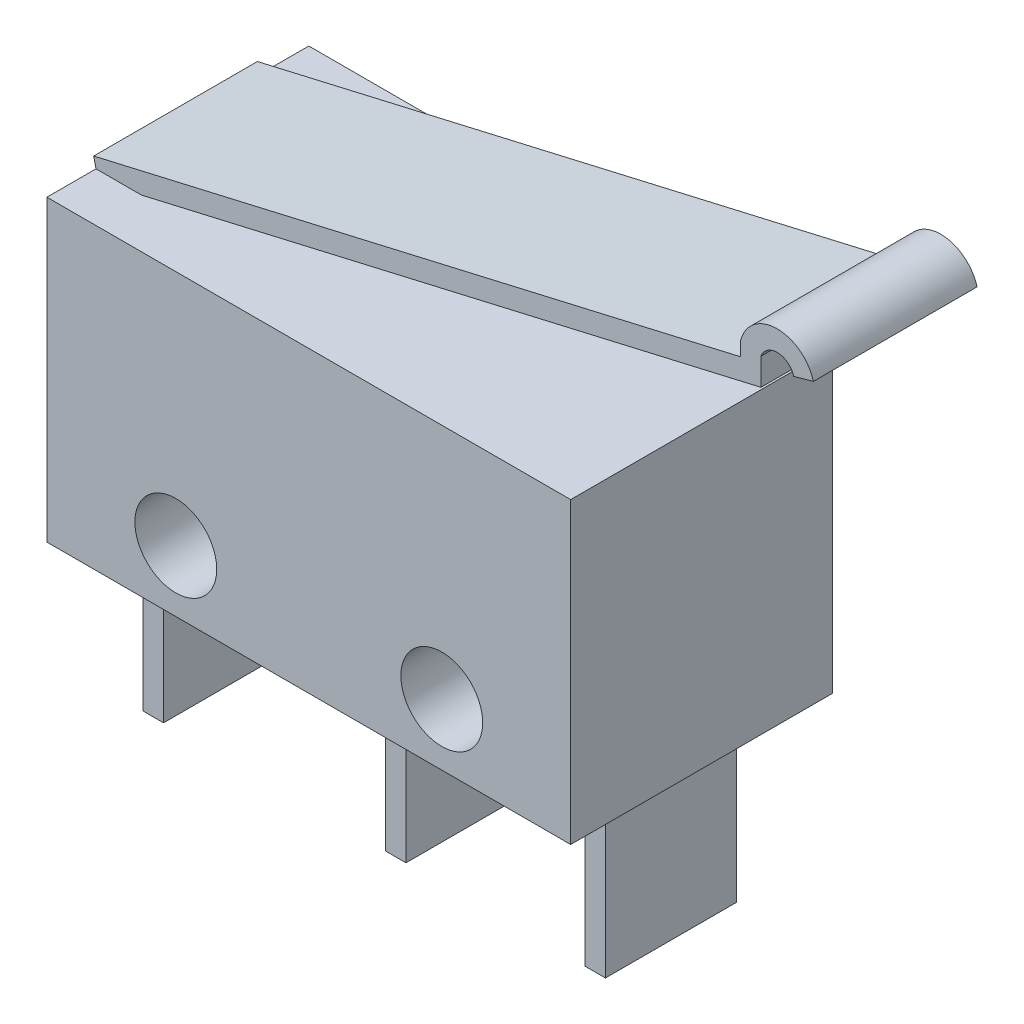
ISO-10303-21;
HEADER;
FILE_DESCRIPTION(('STEP AP214'),'2;1');
FILE_NAME('part.step','',(''),(''),'','','');
FILE_SCHEMA(('AUTOMOTIVE_DESIGN { 1 0 10303 214 1 1 1 1 }'));
ENDSEC;
DATA;
#1=APPLICATION_CONTEXT('core data for automotive mechanical design processes');
#2=APPLICATION_PROTOCOL_DEFINITION('international standard','automotive_design',2000,#1);
#3=PRODUCT_CONTEXT('',#1,'mechanical');
#4=PRODUCT('Part','Part','',(#3));
#5=PRODUCT_RELATED_PRODUCT_CATEGORY('part','',(#4));
#6=PRODUCT_DEFINITION_FORMATION('','',#4);
#7=PRODUCT_DEFINITION_CONTEXT('part definition',#1,'design');
#8=PRODUCT_DEFINITION('design','',#6,#7);
#9=PRODUCT_DEFINITION_SHAPE('','',#8);
#10=(LENGTH_UNIT() NAMED_UNIT(*) SI_UNIT(.MILLI.,.METRE.));
#11=(NAMED_UNIT(*) PLANE_ANGLE_UNIT() SI_UNIT($,.RADIAN.));
#12=(NAMED_UNIT(*) SI_UNIT($,.STERADIAN.) SOLID_ANGLE_UNIT());
#13=UNCERTAINTY_MEASURE_WITH_UNIT(LENGTH_MEASURE(1.E-05),#10,'distance_accuracy_value','');
#14=(GEOMETRIC_REPRESENTATION_CONTEXT(3) GLOBAL_UNCERTAINTY_ASSIGNED_CONTEXT((#13)) GLOBAL_UNIT_ASSIGNED_CONTEXT((#10,
#11,#12)) REPRESENTATION_CONTEXT('',''));
#15=CARTESIAN_POINT('',(0.,0.,0.));
#16=DIRECTION('',(0.,0.,1.));
#17=DIRECTION('',(1.,0.,0.));
#18=AXIS2_PLACEMENT_3D('',#15,#16,#17);
#19=CARTESIAN_POINT('',(-12.8,0.,3.2));
#20=DIRECTION('',(0.,1.,0.));
#21=DIRECTION('',(0.,0.,1.));
#22=AXIS2_PLACEMENT_3D('',#19,#20,#21);
#23=PLANE('',#22);
#24=DIRECTION('',(0.,0.,1.));
#25=VECTOR('',#24,1.);
#26=CARTESIAN_POINT('',(-6.12478735657119,0.,1.6));
#27=LINE('',#26,#25);
#28=CARTESIAN_POINT('',(-6.12478735657119,0.,1.6));
#29=VERTEX_POINT('',#28);
#30=CARTESIAN_POINT('',(-6.12478735657119,0.,-1.6));
#31=VERTEX_POINT('',#30);
#32=EDGE_CURVE('E301',#29,#31,#27,.F.);
#33=ORIENTED_EDGE('',*,*,#32,.F.);
#34=DIRECTION('',(1.,0.,0.));
#35=VECTOR('',#34,1.);
#36=CARTESIAN_POINT('',(-6.12478735657119,0.,1.6));
#37=LINE('',#36,#35);
#38=CARTESIAN_POINT('',(-5.62478735657119,0.,1.6));
#39=VERTEX_POINT('',#38);
#40=EDGE_CURVE('E305',#29,#39,#37,.T.);
#41=ORIENTED_EDGE('',*,*,#40,.T.);
#42=DIRECTION('',(0.,0.,1.));
#43=VECTOR('',#42,1.);
#44=CARTESIAN_POINT('',(-5.62478735657119,0.,1.6));
#45=LINE('',#44,#43);
#46=CARTESIAN_POINT('',(-5.62478735657119,0.,-1.6));
#47=VERTEX_POINT('',#46);
#48=EDGE_CURVE('E320',#39,#47,#45,.F.);
#49=ORIENTED_EDGE('',*,*,#48,.T.);
#50=DIRECTION('',(-1.,0.,0.));
#51=VECTOR('',#50,1.);
#52=CARTESIAN_POINT('',(-5.62478735657119,0.,-1.6));
#53=LINE('',#52,#51);
#54=EDGE_CURVE('E317',#47,#31,#53,.T.);
#55=ORIENTED_EDGE('',*,*,#54,.T.);
#56=EDGE_LOOP('',(#33,#41,#49,#55));
#57=FACE_BOUND('',#56,.T.);
#58=DIRECTION('',(1.,0.,0.));
#59=VECTOR('',#58,1.);
#60=CARTESIAN_POINT('',(-12.8,0.,-3.2));
#61=LINE('',#60,#59);
#62=CARTESIAN_POINT('',(-12.8,0.,-3.2));
#63=VERTEX_POINT('',#62);
#64=CARTESIAN_POINT('',(0.,0.,-3.2));
#65=VERTEX_POINT('',#64);
#66=EDGE_CURVE('E391',#63,#65,#61,.T.);
#67=ORIENTED_EDGE('',*,*,#66,.T.);
#68=DIRECTION('',(0.,0.,-1.));
#69=VECTOR('',#68,1.);
#70=CARTESIAN_POINT('',(0.,0.,3.2));
#71=LINE('',#70,#69);
#72=CARTESIAN_POINT('',(0.,0.,3.2));
#73=VERTEX_POINT('',#72);
#74=EDGE_CURVE('E404',#73,#65,#71,.T.);
#75=ORIENTED_EDGE('',*,*,#74,.F.);
#76=DIRECTION('',(1.,0.,0.));
#77=VECTOR('',#76,1.);
#78=CARTESIAN_POINT('',(-12.8,0.,3.2));
#79=LINE('',#78,#77);
#80=CARTESIAN_POINT('',(-12.8,0.,3.2));
#81=VERTEX_POINT('',#80);
#82=EDGE_CURVE('E381',#81,#73,#79,.T.);
#83=ORIENTED_EDGE('',*,*,#82,.F.);
#84=DIRECTION('',(0.,0.,-1.));
#85=VECTOR('',#84,1.);
#86=CARTESIAN_POINT('',(-12.8,0.,3.2));
#87=LINE('',#86,#85);
#88=EDGE_CURVE('E407',#81,#63,#87,.T.);
#89=ORIENTED_EDGE('',*,*,#88,.T.);
#90=EDGE_LOOP('',(#67,#75,#83,#89));
#91=FACE_BOUND('',#90,.T.);
#92=DIRECTION('',(0.,0.,-1.));
#93=VECTOR('',#92,1.);
#94=CARTESIAN_POINT('',(-12.05,0.,1.6));
#95=LINE('',#94,#93);
#96=CARTESIAN_POINT('',(-12.05,0.,1.6));
#97=VERTEX_POINT('',#96);
#98=CARTESIAN_POINT('',(-12.05,0.,-1.6));
#99=VERTEX_POINT('',#98);
#100=EDGE_CURVE('E333',#97,#99,#95,.T.);
#101=ORIENTED_EDGE('',*,*,#100,.F.);
#102=DIRECTION('',(1.,0.,0.));
#103=VECTOR('',#102,1.);
#104=CARTESIAN_POINT('',(-12.05,0.,1.6));
#105=LINE('',#104,#103);
#106=CARTESIAN_POINT('',(-11.55,0.,1.6));
#107=VERTEX_POINT('',#106);
#108=EDGE_CURVE('E337',#97,#107,#105,.T.);
#109=ORIENTED_EDGE('',*,*,#108,.T.);
#110=DIRECTION('',(0.,0.,-1.));
#111=VECTOR('',#110,1.);
#112=CARTESIAN_POINT('',(-11.55,0.,1.6));
#113=LINE('',#112,#111);
#114=CARTESIAN_POINT('',(-11.55,0.,-1.6));
#115=VERTEX_POINT('',#114);
#116=EDGE_CURVE('E352',#107,#115,#113,.T.);
#117=ORIENTED_EDGE('',*,*,#116,.T.);
#118=DIRECTION('',(-1.,0.,0.));
#119=VECTOR('',#118,1.);
#120=CARTESIAN_POINT('',(-11.55,0.,-1.6));
#121=LINE('',#120,#119);
#122=EDGE_CURVE('E349',#115,#99,#121,.T.);
#123=ORIENTED_EDGE('',*,*,#122,.T.);
#124=EDGE_LOOP('',(#101,#109,#117,#123));
#125=FACE_BOUND('',#124,.T.);
#126=DIRECTION('',(0.,0.,-1.));
#127=VECTOR('',#126,1.);
#128=CARTESIAN_POINT('',(-1.25,0.,1.6));
#129=LINE('',#128,#127);
#130=CARTESIAN_POINT('',(-1.25,0.,1.6));
#131=VERTEX_POINT('',#130);
#132=CARTESIAN_POINT('',(-1.25,0.,-1.6));
#133=VERTEX_POINT('',#132);
#134=EDGE_CURVE('E221',#131,#133,#129,.T.);
#135=ORIENTED_EDGE('',*,*,#134,.F.);
#136=DIRECTION('',(1.,0.,0.));
#137=VECTOR('',#136,1.);
#138=CARTESIAN_POINT('',(-1.25,0.,1.6));
#139=LINE('',#138,#137);
#140=CARTESIAN_POINT('',(-0.749999999999997,0.,1.6));
#141=VERTEX_POINT('',#140);
#142=EDGE_CURVE('E273',#131,#141,#139,.T.);
#143=ORIENTED_EDGE('',*,*,#142,.T.);
#144=DIRECTION('',(0.,0.,-1.));
#145=VECTOR('',#144,1.);
#146=CARTESIAN_POINT('',(-0.749999999999997,0.,1.6));
#147=LINE('',#146,#145);
#148=CARTESIAN_POINT('',(-0.749999999999997,0.,-1.6));
#149=VERTEX_POINT('',#148);
#150=EDGE_CURVE('E288',#141,#149,#147,.T.);
#151=ORIENTED_EDGE('',*,*,#150,.T.);
#152=DIRECTION('',(-1.,0.,0.));
#153=VECTOR('',#152,1.);
#154=CARTESIAN_POINT('',(-0.749999999999997,0.,-1.6));
#155=LINE('',#154,#153);
#156=EDGE_CURVE('E285',#149,#133,#155,.T.);
#157=ORIENTED_EDGE('',*,*,#156,.T.);
#158=EDGE_LOOP('',(#135,#143,#151,#157));
#159=FACE_BOUND('',#158,.T.);
#160=ADVANCED_FACE('F35',(#57,#91,#125,#159),#23,.F.);
#161=CARTESIAN_POINT('',(0.,0.,3.2));
#162=DIRECTION('',(0.,0.,-1.));
#163=DIRECTION('',(-1.,0.,0.));
#164=AXIS2_PLACEMENT_3D('',#161,#162,#163);
#165=PLANE('',#164);
#166=DIRECTION('',(0.,-1.,0.));
#167=VECTOR('',#166,1.);
#168=CARTESIAN_POINT('',(-12.8,0.,3.2));
#169=LINE('',#168,#167);
#170=CARTESIAN_POINT('',(-12.8,7.3,3.2));
#171=VERTEX_POINT('',#170);
#172=EDGE_CURVE('E378',#171,#81,#169,.T.);
#173=ORIENTED_EDGE('',*,*,#172,.T.);
#174=ORIENTED_EDGE('',*,*,#82,.T.);
#175=DIRECTION('',(0.,1.,0.));
#176=VECTOR('',#175,1.);
#177=CARTESIAN_POINT('',(0.,0.,3.2));
#178=LINE('',#177,#176);
#179=CARTESIAN_POINT('',(0.,7.3,3.2));
#180=VERTEX_POINT('',#179);
#181=EDGE_CURVE('E384',#73,#180,#178,.T.);
#182=ORIENTED_EDGE('',*,*,#181,.T.);
#183=DIRECTION('',(-1.,0.,0.));
#184=VECTOR('',#183,1.);
#185=CARTESIAN_POINT('',(-12.8,7.3,3.2));
#186=LINE('',#185,#184);
#187=EDGE_CURVE('E386',#180,#171,#186,.T.);
#188=ORIENTED_EDGE('',*,*,#187,.T.);
#189=EDGE_LOOP('',(#173,#174,#182,#188));
#190=FACE_BOUND('',#189,.T.);
#191=CARTESIAN_POINT('',(-9.65,1.5,3.2));
#192=DIRECTION('',(0.,0.,1.));
#193=DIRECTION('',(1.,0.,0.));
#194=AXIS2_PLACEMENT_3D('',#191,#192,#193);
#195=CIRCLE('',#194,1.);
#196=CARTESIAN_POINT('',(-8.65,1.5,3.2));
#197=VERTEX_POINT('',#196);
#198=EDGE_CURVE('E372',#197,#197,#195,.T.);
#199=ORIENTED_EDGE('',*,*,#198,.F.);
#200=EDGE_LOOP('',(#199));
#201=FACE_BOUND('',#200,.T.);
#202=CARTESIAN_POINT('',(-3.15,1.5,3.2));
#203=DIRECTION('',(0.,0.,1.));
#204=DIRECTION('',(-1.,0.,0.));
#205=AXIS2_PLACEMENT_3D('',#202,#203,#204);
#206=CIRCLE('',#205,1.);
#207=CARTESIAN_POINT('',(-4.15,1.5,3.2));
#208=VERTEX_POINT('',#207);
#209=EDGE_CURVE('E366',#208,#208,#206,.T.);
#210=ORIENTED_EDGE('',*,*,#209,.F.);
#211=EDGE_LOOP('',(#210));
#212=FACE_BOUND('',#211,.T.);
#213=ADVANCED_FACE('F433',(#190,#201,#212),#165,.F.);
#214=CARTESIAN_POINT('',(0.,0.,-3.2));
#215=DIRECTION('',(0.,0.,-1.));
#216=DIRECTION('',(-1.,0.,0.));
#217=AXIS2_PLACEMENT_3D('',#214,#215,#216);
#218=PLANE('',#217);
#219=CARTESIAN_POINT('',(-9.65,1.5,-3.2));
#220=DIRECTION('',(0.,0.,1.));
#221=DIRECTION('',(1.,0.,0.));
#222=AXIS2_PLACEMENT_3D('',#219,#220,#221);
#223=CIRCLE('',#222,1.);
#224=CARTESIAN_POINT('',(-8.65,1.5,-3.2));
#225=VERTEX_POINT('',#224);
#226=EDGE_CURVE('E369',#225,#225,#223,.T.);
#227=ORIENTED_EDGE('',*,*,#226,.T.);
#228=EDGE_LOOP('',(#227));
#229=FACE_BOUND('',#228,.T.);
#230=DIRECTION('',(0.,-1.,0.));
#231=VECTOR('',#230,1.);
#232=CARTESIAN_POINT('',(-12.8,0.,-3.2));
#233=LINE('',#232,#231);
#234=CARTESIAN_POINT('',(-12.8,7.3,-3.2));
#235=VERTEX_POINT('',#234);
#236=EDGE_CURVE('E375',#235,#63,#233,.T.);
#237=ORIENTED_EDGE('',*,*,#236,.F.);
#238=DIRECTION('',(-1.,0.,0.));
#239=VECTOR('',#238,1.);
#240=CARTESIAN_POINT('',(-12.8,7.3,-3.2));
#241=LINE('',#240,#239);
#242=CARTESIAN_POINT('',(0.,7.3,-3.2));
#243=VERTEX_POINT('',#242);
#244=EDGE_CURVE('E382',#243,#235,#241,.T.);
#245=ORIENTED_EDGE('',*,*,#244,.F.);
#246=DIRECTION('',(0.,1.,0.));
#247=VECTOR('',#246,1.);
#248=CARTESIAN_POINT('',(0.,0.,-3.2));
#249=LINE('',#248,#247);
#250=EDGE_CURVE('E393',#65,#243,#249,.T.);
#251=ORIENTED_EDGE('',*,*,#250,.F.);
#252=ORIENTED_EDGE('',*,*,#66,.F.);
#253=EDGE_LOOP('',(#237,#245,#251,#252));
#254=FACE_BOUND('',#253,.T.);
#255=CARTESIAN_POINT('',(-3.15,1.5,-3.2));
#256=DIRECTION('',(0.,0.,1.));
#257=DIRECTION('',(-1.,0.,0.));
#258=AXIS2_PLACEMENT_3D('',#255,#256,#257);
#259=CIRCLE('',#258,1.);
#260=CARTESIAN_POINT('',(-4.15,1.5,-3.2));
#261=VERTEX_POINT('',#260);
#262=EDGE_CURVE('E365',#261,#261,#259,.T.);
#263=ORIENTED_EDGE('',*,*,#262,.T.);
#264=EDGE_LOOP('',(#263));
#265=FACE_BOUND('',#264,.T.);
#266=ADVANCED_FACE('F438',(#229,#254,#265),#218,.T.);
#267=CARTESIAN_POINT('',(-12.8,0.,3.2));
#268=DIRECTION('',(1.,0.,0.));
#269=DIRECTION('',(0.,0.,-1.));
#270=AXIS2_PLACEMENT_3D('',#267,#268,#269);
#271=PLANE('',#270);
#272=ORIENTED_EDGE('',*,*,#236,.T.);
#273=ORIENTED_EDGE('',*,*,#88,.F.);
#274=ORIENTED_EDGE('',*,*,#172,.F.);
#275=DIRECTION('',(0.,0.,-1.));
#276=VECTOR('',#275,1.);
#277=CARTESIAN_POINT('',(-12.8,7.3,3.2));
#278=LINE('',#277,#276);
#279=CARTESIAN_POINT('',(-12.8,7.3,2.));
#280=VERTEX_POINT('',#279);
#281=EDGE_CURVE('E397',#171,#280,#278,.T.);
#282=ORIENTED_EDGE('',*,*,#281,.T.);
#283=CARTESIAN_POINT('',(-12.8,7.3,-2.));
#284=VERTEX_POINT('',#283);
#285=EDGE_CURVE('E401',#280,#284,#278,.T.);
#286=ORIENTED_EDGE('',*,*,#285,.T.);
#287=EDGE_CURVE('E388',#284,#235,#278,.T.);
#288=ORIENTED_EDGE('',*,*,#287,.T.);
#289=EDGE_LOOP('',(#272,#273,#274,#282,#286,#288));
#290=FACE_BOUND('',#289,.T.);
#291=ADVANCED_FACE('F37',(#290),#271,.F.);
#292=CARTESIAN_POINT('',(0.,0.,3.2));
#293=DIRECTION('',(-1.,0.,0.));
#294=DIRECTION('',(0.,0.,1.));
#295=AXIS2_PLACEMENT_3D('',#292,#293,#294);
#296=PLANE('',#295);
#297=ORIENTED_EDGE('',*,*,#250,.T.);
#298=DIRECTION('',(0.,0.,-1.));
#299=VECTOR('',#298,1.);
#300=CARTESIAN_POINT('',(0.,7.3,3.2));
#301=LINE('',#300,#299);
#302=EDGE_CURVE('E400',#180,#243,#301,.T.);
#303=ORIENTED_EDGE('',*,*,#302,.F.);
#304=ORIENTED_EDGE('',*,*,#181,.F.);
#305=ORIENTED_EDGE('',*,*,#74,.T.);
#306=EDGE_LOOP('',(#297,#303,#304,#305));
#307=FACE_BOUND('',#306,.T.);
#308=ADVANCED_FACE('F444',(#307),#296,.F.);
#309=CARTESIAN_POINT('',(-12.8,7.3,3.2));
#310=DIRECTION('',(0.,-1.,0.));
#311=DIRECTION('',(0.,0.,-1.));
#312=AXIS2_PLACEMENT_3D('',#309,#310,#311);
#313=PLANE('',#312);
#314=DIRECTION('',(0.,0.,-1.));
#315=VECTOR('',#314,1.);
#316=CARTESIAN_POINT('',(-11.690389120515,7.3,3.2));
#317=LINE('',#316,#315);
#318=CARTESIAN_POINT('',(-11.690389120515,7.3,2.));
#319=VERTEX_POINT('',#318);
#320=CARTESIAN_POINT('',(-11.690389120515,7.3,-2.));
#321=VERTEX_POINT('',#320);
#322=EDGE_CURVE('E43',#319,#321,#317,.T.);
#323=ORIENTED_EDGE('',*,*,#322,.F.);
#324=DIRECTION('',(-1.,0.,0.));
#325=VECTOR('',#324,1.);
#326=CARTESIAN_POINT('',(-12.8,7.3,2.));
#327=LINE('',#326,#325);
#328=EDGE_CURVE('E11',#319,#280,#327,.T.);
#329=ORIENTED_EDGE('',*,*,#328,.T.);
#330=ORIENTED_EDGE('',*,*,#281,.F.);
#331=ORIENTED_EDGE('',*,*,#187,.F.);
#332=ORIENTED_EDGE('',*,*,#302,.T.);
#333=ORIENTED_EDGE('',*,*,#244,.T.);
#334=ORIENTED_EDGE('',*,*,#287,.F.);
#335=DIRECTION('',(-1.,0.,0.));
#336=VECTOR('',#335,1.);
#337=CARTESIAN_POINT('',(-12.8,7.3,-2.));
#338=LINE('',#337,#336);
#339=EDGE_CURVE('E53',#321,#284,#338,.T.);
#340=ORIENTED_EDGE('',*,*,#339,.F.);
#341=EDGE_LOOP('',(#323,#329,#330,#331,#332,#333,#334,#340));
#342=FACE_BOUND('',#341,.T.);
#343=ADVANCED_FACE('F447',(#342),#313,.F.);
#344=CARTESIAN_POINT('',(-9.65,1.5,3.2));
#345=DIRECTION('',(0.,0.,-1.));
#346=DIRECTION('',(-1.,0.,0.));
#347=AXIS2_PLACEMENT_3D('',#344,#345,#346);
#348=CYLINDRICAL_SURFACE('',#347,1.);
#349=ORIENTED_EDGE('',*,*,#198,.T.);
#350=EDGE_LOOP('',(#349));
#351=FACE_BOUND('',#350,.T.);
#352=ORIENTED_EDGE('',*,*,#226,.F.);
#353=EDGE_LOOP('',(#352));
#354=FACE_BOUND('',#353,.T.);
#355=ADVANCED_FACE('F451',(#351,#354),#348,.F.);
#356=CARTESIAN_POINT('',(-3.15,1.5,3.2));
#357=DIRECTION('',(0.,0.,-1.));
#358=DIRECTION('',(-1.,0.,0.));
#359=AXIS2_PLACEMENT_3D('',#356,#357,#358);
#360=CYLINDRICAL_SURFACE('',#359,1.);
#361=ORIENTED_EDGE('',*,*,#209,.T.);
#362=EDGE_LOOP('',(#361));
#363=FACE_BOUND('',#362,.T.);
#364=ORIENTED_EDGE('',*,*,#262,.F.);
#365=EDGE_LOOP('',(#364));
#366=FACE_BOUND('',#365,.T.);
#367=ADVANCED_FACE('F457',(#363,#366),#360,.F.);
#368=CARTESIAN_POINT('',(-12.05,-4.,1.6));
#369=DIRECTION('',(1.,0.,0.));
#370=DIRECTION('',(0.,0.,-1.));
#371=AXIS2_PLACEMENT_3D('',#368,#369,#370);
#372=PLANE('',#371);
#373=ORIENTED_EDGE('',*,*,#100,.T.);
#374=DIRECTION('',(0.,1.,0.));
#375=VECTOR('',#374,1.);
#376=CARTESIAN_POINT('',(-12.05,-4.,-1.6));
#377=LINE('',#376,#375);
#378=CARTESIAN_POINT('',(-12.05,-4.,-1.6));
#379=VERTEX_POINT('',#378);
#380=EDGE_CURVE('E363',#379,#99,#377,.T.);
#381=ORIENTED_EDGE('',*,*,#380,.F.);
#382=DIRECTION('',(0.,0.,-1.));
#383=VECTOR('',#382,1.);
#384=CARTESIAN_POINT('',(-12.05,-4.,1.6));
#385=LINE('',#384,#383);
#386=CARTESIAN_POINT('',(-12.05,-4.,1.6));
#387=VERTEX_POINT('',#386);
#388=EDGE_CURVE('E334',#387,#379,#385,.T.);
#389=ORIENTED_EDGE('',*,*,#388,.F.);
#390=DIRECTION('',(0.,1.,0.));
#391=VECTOR('',#390,1.);
#392=CARTESIAN_POINT('',(-12.05,-4.,1.6));
#393=LINE('',#392,#391);
#394=EDGE_CURVE('E346',#387,#97,#393,.T.);
#395=ORIENTED_EDGE('',*,*,#394,.T.);
#396=EDGE_LOOP('',(#373,#381,#389,#395));
#397=FACE_BOUND('',#396,.T.);
#398=ADVANCED_FACE('F461',(#397),#372,.F.);
#399=CARTESIAN_POINT('',(-11.55,-4.,-1.6));
#400=DIRECTION('',(0.,0.,-1.));
#401=DIRECTION('',(-1.,0.,0.));
#402=AXIS2_PLACEMENT_3D('',#399,#400,#401);
#403=PLANE('',#402);
#404=ORIENTED_EDGE('',*,*,#122,.F.);
#405=DIRECTION('',(0.,1.,0.));
#406=VECTOR('',#405,1.);
#407=CARTESIAN_POINT('',(-11.55,-4.,-1.6));
#408=LINE('',#407,#406);
#409=CARTESIAN_POINT('',(-11.55,-4.,-1.6));
#410=VERTEX_POINT('',#409);
#411=EDGE_CURVE('E361',#410,#115,#408,.T.);
#412=ORIENTED_EDGE('',*,*,#411,.F.);
#413=DIRECTION('',(-1.,0.,0.));
#414=VECTOR('',#413,1.);
#415=CARTESIAN_POINT('',(-11.55,-4.,-1.6));
#416=LINE('',#415,#414);
#417=EDGE_CURVE('E336',#410,#379,#416,.T.);
#418=ORIENTED_EDGE('',*,*,#417,.T.);
#419=ORIENTED_EDGE('',*,*,#380,.T.);
#420=EDGE_LOOP('',(#404,#412,#418,#419));
#421=FACE_BOUND('',#420,.T.);
#422=ADVANCED_FACE('F465',(#421),#403,.T.);
#423=CARTESIAN_POINT('',(-11.55,-4.,1.6));
#424=DIRECTION('',(1.,0.,0.));
#425=DIRECTION('',(0.,0.,-1.));
#426=AXIS2_PLACEMENT_3D('',#423,#424,#425);
#427=PLANE('',#426);
#428=ORIENTED_EDGE('',*,*,#116,.F.);
#429=DIRECTION('',(0.,1.,0.));
#430=VECTOR('',#429,1.);
#431=CARTESIAN_POINT('',(-11.55,-4.,1.6));
#432=LINE('',#431,#430);
#433=CARTESIAN_POINT('',(-11.55,-4.,1.6));
#434=VERTEX_POINT('',#433);
#435=EDGE_CURVE('E358',#434,#107,#432,.T.);
#436=ORIENTED_EDGE('',*,*,#435,.F.);
#437=DIRECTION('',(0.,0.,-1.));
#438=VECTOR('',#437,1.);
#439=CARTESIAN_POINT('',(-11.55,-4.,1.6));
#440=LINE('',#439,#438);
#441=EDGE_CURVE('E340',#434,#410,#440,.T.);
#442=ORIENTED_EDGE('',*,*,#441,.T.);
#443=ORIENTED_EDGE('',*,*,#411,.T.);
#444=EDGE_LOOP('',(#428,#436,#442,#443));
#445=FACE_BOUND('',#444,.T.);
#446=ADVANCED_FACE('F469',(#445),#427,.T.);
#447=CARTESIAN_POINT('',(-12.05,-4.,1.6));
#448=DIRECTION('',(0.,0.,1.));
#449=DIRECTION('',(1.,0.,0.));
#450=AXIS2_PLACEMENT_3D('',#447,#448,#449);
#451=PLANE('',#450);
#452=ORIENTED_EDGE('',*,*,#108,.F.);
#453=ORIENTED_EDGE('',*,*,#394,.F.);
#454=DIRECTION('',(1.,0.,0.));
#455=VECTOR('',#454,1.);
#456=CARTESIAN_POINT('',(-12.05,-4.,1.6));
#457=LINE('',#456,#455);
#458=EDGE_CURVE('E343',#387,#434,#457,.T.);
#459=ORIENTED_EDGE('',*,*,#458,.T.);
#460=ORIENTED_EDGE('',*,*,#435,.T.);
#461=EDGE_LOOP('',(#452,#453,#459,#460));
#462=FACE_BOUND('',#461,.T.);
#463=ADVANCED_FACE('F473',(#462),#451,.T.);
#464=CARTESIAN_POINT('',(0.,-4.,0.));
#465=DIRECTION('',(0.,1.,0.));
#466=DIRECTION('',(-1.,0.,0.));
#467=AXIS2_PLACEMENT_3D('',#464,#465,#466);
#468=PLANE('',#467);
#469=ORIENTED_EDGE('',*,*,#388,.T.);
#470=ORIENTED_EDGE('',*,*,#417,.F.);
#471=ORIENTED_EDGE('',*,*,#441,.F.);
#472=ORIENTED_EDGE('',*,*,#458,.F.);
#473=EDGE_LOOP('',(#469,#470,#471,#472));
#474=FACE_BOUND('',#473,.T.);
#475=ADVANCED_FACE('F477',(#474),#468,.F.);
#476=CARTESIAN_POINT('',(-6.12478735657119,-4.,1.6));
#477=DIRECTION('',(1.,0.,0.));
#478=DIRECTION('',(0.,0.,-1.));
#479=AXIS2_PLACEMENT_3D('',#476,#477,#478);
#480=PLANE('',#479);
#481=ORIENTED_EDGE('',*,*,#32,.T.);
#482=DIRECTION('',(0.,1.,0.));
#483=VECTOR('',#482,1.);
#484=CARTESIAN_POINT('',(-6.12478735657119,-4.,-1.6));
#485=LINE('',#484,#483);
#486=CARTESIAN_POINT('',(-6.12478735657119,-4.,-1.6));
#487=VERTEX_POINT('',#486);
#488=EDGE_CURVE('E331',#487,#31,#485,.T.);
#489=ORIENTED_EDGE('',*,*,#488,.F.);
#490=DIRECTION('',(0.,0.,1.));
#491=VECTOR('',#490,1.);
#492=CARTESIAN_POINT('',(-6.12478735657119,-4.,1.6));
#493=LINE('',#492,#491);
#494=CARTESIAN_POINT('',(-6.12478735657119,-4.,1.6));
#495=VERTEX_POINT('',#494);
#496=EDGE_CURVE('E302',#495,#487,#493,.F.);
#497=ORIENTED_EDGE('',*,*,#496,.F.);
#498=DIRECTION('',(0.,1.,0.));
#499=VECTOR('',#498,1.);
#500=CARTESIAN_POINT('',(-6.12478735657119,-4.,1.6));
#501=LINE('',#500,#499);
#502=EDGE_CURVE('E314',#495,#29,#501,.T.);
#503=ORIENTED_EDGE('',*,*,#502,.T.);
#504=EDGE_LOOP('',(#481,#489,#497,#503));
#505=FACE_BOUND('',#504,.T.);
#506=ADVANCED_FACE('F481',(#505),#480,.F.);
#507=CARTESIAN_POINT('',(-5.62478735657119,-4.,-1.6));
#508=DIRECTION('',(0.,0.,-1.));
#509=DIRECTION('',(-1.,0.,0.));
#510=AXIS2_PLACEMENT_3D('',#507,#508,#509);
#511=PLANE('',#510);
#512=ORIENTED_EDGE('',*,*,#54,.F.);
#513=DIRECTION('',(0.,1.,0.));
#514=VECTOR('',#513,1.);
#515=CARTESIAN_POINT('',(-5.62478735657119,-4.,-1.6));
#516=LINE('',#515,#514);
#517=CARTESIAN_POINT('',(-5.62478735657119,-4.,-1.6));
#518=VERTEX_POINT('',#517);
#519=EDGE_CURVE('E329',#518,#47,#516,.T.);
#520=ORIENTED_EDGE('',*,*,#519,.F.);
#521=DIRECTION('',(-1.,0.,0.));
#522=VECTOR('',#521,1.);
#523=CARTESIAN_POINT('',(-5.62478735657119,-4.,-1.6));
#524=LINE('',#523,#522);
#525=EDGE_CURVE('E304',#518,#487,#524,.T.);
#526=ORIENTED_EDGE('',*,*,#525,.T.);
#527=ORIENTED_EDGE('',*,*,#488,.T.);
#528=EDGE_LOOP('',(#512,#520,#526,#527));
#529=FACE_BOUND('',#528,.T.);
#530=ADVANCED_FACE('F485',(#529),#511,.T.);
#531=CARTESIAN_POINT('',(-5.62478735657119,-4.,1.6));
#532=DIRECTION('',(1.,0.,0.));
#533=DIRECTION('',(0.,0.,-1.));
#534=AXIS2_PLACEMENT_3D('',#531,#532,#533);
#535=PLANE('',#534);
#536=ORIENTED_EDGE('',*,*,#48,.F.);
#537=DIRECTION('',(0.,1.,0.));
#538=VECTOR('',#537,1.);
#539=CARTESIAN_POINT('',(-5.62478735657119,-4.,1.6));
#540=LINE('',#539,#538);
#541=CARTESIAN_POINT('',(-5.62478735657119,-4.,1.6));
#542=VERTEX_POINT('',#541);
#543=EDGE_CURVE('E326',#542,#39,#540,.T.);
#544=ORIENTED_EDGE('',*,*,#543,.F.);
#545=DIRECTION('',(0.,0.,1.));
#546=VECTOR('',#545,1.);
#547=CARTESIAN_POINT('',(-5.62478735657119,-4.,1.6));
#548=LINE('',#547,#546);
#549=EDGE_CURVE('E308',#542,#518,#548,.F.);
#550=ORIENTED_EDGE('',*,*,#549,.T.);
#551=ORIENTED_EDGE('',*,*,#519,.T.);
#552=EDGE_LOOP('',(#536,#544,#550,#551));
#553=FACE_BOUND('',#552,.T.);
#554=ADVANCED_FACE('F489',(#553),#535,.T.);
#555=CARTESIAN_POINT('',(-6.12478735657119,-4.,1.6));
#556=DIRECTION('',(0.,0.,1.));
#557=DIRECTION('',(1.,0.,0.));
#558=AXIS2_PLACEMENT_3D('',#555,#556,#557);
#559=PLANE('',#558);
#560=ORIENTED_EDGE('',*,*,#40,.F.);
#561=ORIENTED_EDGE('',*,*,#502,.F.);
#562=DIRECTION('',(1.,0.,0.));
#563=VECTOR('',#562,1.);
#564=CARTESIAN_POINT('',(-6.12478735657119,-4.,1.6));
#565=LINE('',#564,#563);
#566=EDGE_CURVE('E311',#495,#542,#565,.T.);
#567=ORIENTED_EDGE('',*,*,#566,.T.);
#568=ORIENTED_EDGE('',*,*,#543,.T.);
#569=EDGE_LOOP('',(#560,#561,#567,#568));
#570=FACE_BOUND('',#569,.T.);
#571=ADVANCED_FACE('F493',(#570),#559,.T.);
#572=CARTESIAN_POINT('',(0.,-4.,0.));
#573=DIRECTION('',(0.,-1.,0.));
#574=DIRECTION('',(1.,0.,0.));
#575=AXIS2_PLACEMENT_3D('',#572,#573,#574);
#576=PLANE('',#575);
#577=ORIENTED_EDGE('',*,*,#496,.T.);
#578=ORIENTED_EDGE('',*,*,#525,.F.);
#579=ORIENTED_EDGE('',*,*,#549,.F.);
#580=ORIENTED_EDGE('',*,*,#566,.F.);
#581=EDGE_LOOP('',(#577,#578,#579,#580));
#582=FACE_BOUND('',#581,.T.);
#583=ADVANCED_FACE('F497',(#582),#576,.T.);
#584=CARTESIAN_POINT('',(-1.25,-4.,1.6));
#585=DIRECTION('',(1.,0.,0.));
#586=DIRECTION('',(0.,0.,-1.));
#587=AXIS2_PLACEMENT_3D('',#584,#585,#586);
#588=PLANE('',#587);
#589=ORIENTED_EDGE('',*,*,#134,.T.);
#590=DIRECTION('',(0.,1.,0.));
#591=VECTOR('',#590,1.);
#592=CARTESIAN_POINT('',(-1.25,-4.,-1.6));
#593=LINE('',#592,#591);
#594=CARTESIAN_POINT('',(-1.25,-4.,-1.6));
#595=VERTEX_POINT('',#594);
#596=EDGE_CURVE('E299',#595,#133,#593,.T.);
#597=ORIENTED_EDGE('',*,*,#596,.F.);
#598=DIRECTION('',(0.,0.,-1.));
#599=VECTOR('',#598,1.);
#600=CARTESIAN_POINT('',(-1.25,-4.,1.6));
#601=LINE('',#600,#599);
#602=CARTESIAN_POINT('',(-1.25,-4.,1.6));
#603=VERTEX_POINT('',#602);
#604=EDGE_CURVE('E270',#603,#595,#601,.T.);
#605=ORIENTED_EDGE('',*,*,#604,.F.);
#606=DIRECTION('',(0.,1.,0.));
#607=VECTOR('',#606,1.);
#608=CARTESIAN_POINT('',(-1.25,-4.,1.6));
#609=LINE('',#608,#607);
#610=EDGE_CURVE('E282',#603,#131,#609,.T.);
#611=ORIENTED_EDGE('',*,*,#610,.T.);
#612=EDGE_LOOP('',(#589,#597,#605,#611));
#613=FACE_BOUND('',#612,.T.);
#614=ADVANCED_FACE('F501',(#613),#588,.F.);
#615=CARTESIAN_POINT('',(-0.749999999999997,-4.,-1.6));
#616=DIRECTION('',(0.,0.,-1.));
#617=DIRECTION('',(-1.,0.,0.));
#618=AXIS2_PLACEMENT_3D('',#615,#616,#617);
#619=PLANE('',#618);
#620=ORIENTED_EDGE('',*,*,#156,.F.);
#621=DIRECTION('',(0.,1.,0.));
#622=VECTOR('',#621,1.);
#623=CARTESIAN_POINT('',(-0.749999999999997,-4.,-1.6));
#624=LINE('',#623,#622);
#625=CARTESIAN_POINT('',(-0.749999999999997,-4.,-1.6));
#626=VERTEX_POINT('',#625);
#627=EDGE_CURVE('E297',#626,#149,#624,.T.);
#628=ORIENTED_EDGE('',*,*,#627,.F.);
#629=DIRECTION('',(-1.,0.,0.));
#630=VECTOR('',#629,1.);
#631=CARTESIAN_POINT('',(-0.749999999999997,-4.,-1.6));
#632=LINE('',#631,#630);
#633=EDGE_CURVE('E272',#626,#595,#632,.T.);
#634=ORIENTED_EDGE('',*,*,#633,.T.);
#635=ORIENTED_EDGE('',*,*,#596,.T.);
#636=EDGE_LOOP('',(#620,#628,#634,#635));
#637=FACE_BOUND('',#636,.T.);
#638=ADVANCED_FACE('F505',(#637),#619,.T.);
#639=CARTESIAN_POINT('',(-0.749999999999997,-4.,1.6));
#640=DIRECTION('',(1.,0.,0.));
#641=DIRECTION('',(0.,0.,-1.));
#642=AXIS2_PLACEMENT_3D('',#639,#640,#641);
#643=PLANE('',#642);
#644=ORIENTED_EDGE('',*,*,#150,.F.);
#645=DIRECTION('',(0.,1.,0.));
#646=VECTOR('',#645,1.);
#647=CARTESIAN_POINT('',(-0.749999999999997,-4.,1.6));
#648=LINE('',#647,#646);
#649=CARTESIAN_POINT('',(-0.749999999999997,-4.,1.6));
#650=VERTEX_POINT('',#649);
#651=EDGE_CURVE('E294',#650,#141,#648,.T.);
#652=ORIENTED_EDGE('',*,*,#651,.F.);
#653=DIRECTION('',(0.,0.,-1.));
#654=VECTOR('',#653,1.);
#655=CARTESIAN_POINT('',(-0.749999999999997,-4.,1.6));
#656=LINE('',#655,#654);
#657=EDGE_CURVE('E276',#650,#626,#656,.T.);
#658=ORIENTED_EDGE('',*,*,#657,.T.);
#659=ORIENTED_EDGE('',*,*,#627,.T.);
#660=EDGE_LOOP('',(#644,#652,#658,#659));
#661=FACE_BOUND('',#660,.T.);
#662=ADVANCED_FACE('F509',(#661),#643,.T.);
#663=CARTESIAN_POINT('',(-1.25,-4.,1.6));
#664=DIRECTION('',(0.,0.,1.));
#665=DIRECTION('',(1.,0.,0.));
#666=AXIS2_PLACEMENT_3D('',#663,#664,#665);
#667=PLANE('',#666);
#668=ORIENTED_EDGE('',*,*,#142,.F.);
#669=ORIENTED_EDGE('',*,*,#610,.F.);
#670=DIRECTION('',(1.,0.,0.));
#671=VECTOR('',#670,1.);
#672=CARTESIAN_POINT('',(-1.25,-4.,1.6));
#673=LINE('',#672,#671);
#674=EDGE_CURVE('E279',#603,#650,#673,.T.);
#675=ORIENTED_EDGE('',*,*,#674,.T.);
#676=ORIENTED_EDGE('',*,*,#651,.T.);
#677=EDGE_LOOP('',(#668,#669,#675,#676));
#678=FACE_BOUND('',#677,.T.);
#679=ADVANCED_FACE('F513',(#678),#667,.T.);
#680=CARTESIAN_POINT('',(0.,-4.,0.));
#681=DIRECTION('',(0.,1.,0.));
#682=DIRECTION('',(-1.,0.,0.));
#683=AXIS2_PLACEMENT_3D('',#680,#681,#682);
#684=PLANE('',#683);
#685=ORIENTED_EDGE('',*,*,#604,.T.);
#686=ORIENTED_EDGE('',*,*,#633,.F.);
#687=ORIENTED_EDGE('',*,*,#657,.F.);
#688=ORIENTED_EDGE('',*,*,#674,.F.);
#689=EDGE_LOOP('',(#685,#686,#687,#688));
#690=FACE_BOUND('',#689,.T.);
#691=ADVANCED_FACE('F517',(#690),#684,.F.);
#692=CARTESIAN_POINT('',(-12.743673948088,7.05642788362375,2.));
#693=DIRECTION('',(-0.974288465505002,-0.225304207648033,0.));
#694=DIRECTION('',(0.225304207648033,-0.974288465505002,0.));
#695=AXIS2_PLACEMENT_3D('',#692,#693,#694);
#696=PLANE('',#695);
#697=ORIENTED_EDGE('',*,*,#285,.F.);
#698=DIRECTION('',(-0.225304207648033,0.974288465505002,0.));
#699=VECTOR('',#698,1.);
#700=CARTESIAN_POINT('',(-12.743673948088,7.05642788362375,2.));
#701=LINE('',#700,#699);
#702=CARTESIAN_POINT('',(-12.856326051912,7.54357211637625,2.));
#703=VERTEX_POINT('',#702);
#704=EDGE_CURVE('E235',#280,#703,#701,.T.);
#705=ORIENTED_EDGE('',*,*,#704,.T.);
#706=DIRECTION('',(0.,0.,-1.));
#707=VECTOR('',#706,1.);
#708=CARTESIAN_POINT('',(-12.856326051912,7.54357211637625,2.));
#709=LINE('',#708,#707);
#710=CARTESIAN_POINT('',(-12.856326051912,7.54357211637625,-2.));
#711=VERTEX_POINT('',#710);
#712=EDGE_CURVE('E262',#703,#711,#709,.T.);
#713=ORIENTED_EDGE('',*,*,#712,.T.);
#714=DIRECTION('',(-0.225304207648033,0.974288465505002,0.));
#715=VECTOR('',#714,1.);
#716=CARTESIAN_POINT('',(-12.743673948088,7.05642788362375,-2.));
#717=LINE('',#716,#715);
#718=EDGE_CURVE('E253',#284,#711,#717,.T.);
#719=ORIENTED_EDGE('',*,*,#718,.F.);
#720=EDGE_LOOP('',(#697,#705,#713,#719));
#721=FACE_BOUND('',#720,.T.);
#722=ADVANCED_FACE('F521',(#721),#696,.T.);
#723=CARTESIAN_POINT('',(-12.743673948088,7.05642788362375,2.));
#724=DIRECTION('',(-0.225304207648032,0.974288465505003,0.));
#725=DIRECTION('',(-0.974288465505003,-0.225304207648032,0.));
#726=AXIS2_PLACEMENT_3D('',#723,#724,#725);
#727=PLANE('',#726);
#728=DIRECTION('',(0.974288465505003,0.225304207648032,0.));
#729=VECTOR('',#728,1.);
#730=CARTESIAN_POINT('',(-12.743673948088,7.05642788362375,2.));
#731=LINE('',#730,#729);
#732=CARTESIAN_POINT('',(3.45,10.8012149841191,2.));
#733=VERTEX_POINT('',#732);
#734=EDGE_CURVE('E237',#319,#733,#731,.T.);
#735=ORIENTED_EDGE('',*,*,#734,.F.);
#736=ORIENTED_EDGE('',*,*,#322,.T.);
#737=DIRECTION('',(0.974288465505003,0.225304207648032,0.));
#738=VECTOR('',#737,1.);
#739=CARTESIAN_POINT('',(-12.743673948088,7.05642788362375,-2.));
#740=LINE('',#739,#738);
#741=CARTESIAN_POINT('',(3.45,10.8012149841191,-2.));
#742=VERTEX_POINT('',#741);
#743=EDGE_CURVE('E255',#321,#742,#740,.T.);
#744=ORIENTED_EDGE('',*,*,#743,.T.);
#745=DIRECTION('',(0.,0.,-1.));
#746=VECTOR('',#745,1.);
#747=CARTESIAN_POINT('',(3.45,10.8012149841191,2.));
#748=LINE('',#747,#746);
#749=EDGE_CURVE('E259',#733,#742,#748,.T.);
#750=ORIENTED_EDGE('',*,*,#749,.F.);
#751=EDGE_LOOP('',(#735,#736,#744,#750));
#752=FACE_BOUND('',#751,.T.);
#753=ADVANCED_FACE('F413',(#752),#727,.F.);
#754=CARTESIAN_POINT('',(3.84574506067493,11.3179652265795,2.));
#755=DIRECTION('',(0.,0.,1.));
#756=DIRECTION('',(1.,0.,0.));
#757=AXIS2_PLACEMENT_3D('',#754,#755,#756);
#758=PLANE('',#757);
#759=ORIENTED_EDGE('',*,*,#328,.F.);
#760=ORIENTED_EDGE('',*,*,#734,.T.);
#761=DIRECTION('',(0.,1.,0.));
#762=VECTOR('',#761,1.);
#763=CARTESIAN_POINT('',(3.45,11.,2.));
#764=LINE('',#763,#762);
#765=CARTESIAN_POINT('',(3.45,11.4613285018695,2.));
#766=VERTEX_POINT('',#765);
#767=EDGE_CURVE('E207',#733,#766,#764,.T.);
#768=ORIENTED_EDGE('',*,*,#767,.T.);
#769=CARTESIAN_POINT('',(3.84574506067493,11.3179652265795,2.));
#770=DIRECTION('',(0.,0.,1.));
#771=DIRECTION('',(1.,0.,0.));
#772=AXIS2_PLACEMENT_3D('',#769,#770,#771);
#773=CIRCLE('',#772,0.42091232073969);
#774=CARTESIAN_POINT('',(4.25086812026521,11.4321689407866,2.));
#775=VERTEX_POINT('',#774);
#776=EDGE_CURVE('E199',#766,#775,#773,.F.);
#777=ORIENTED_EDGE('',*,*,#776,.T.);
#778=DIRECTION('',(-0.962488004338612,-0.271324236853763,0.));
#779=VECTOR('',#778,1.);
#780=CARTESIAN_POINT('',(4.73211212243451,11.5678310592134,2.));
#781=LINE('',#780,#779);
#782=CARTESIAN_POINT('',(4.73211212243451,11.5678310592134,2.));
#783=VERTEX_POINT('',#782);
#784=EDGE_CURVE('E204',#783,#775,#781,.T.);
#785=ORIENTED_EDGE('',*,*,#784,.F.);
#786=CARTESIAN_POINT('',(3.84574506067493,11.3179652265795,2.));
#787=DIRECTION('',(0.,0.,1.));
#788=DIRECTION('',(1.,0.,0.));
#789=AXIS2_PLACEMENT_3D('',#786,#787,#788);
#790=CIRCLE('',#789,0.92091232073969);
#791=CARTESIAN_POINT('',(2.95,11.5317882580018,2.));
#792=VERTEX_POINT('',#791);
#793=EDGE_CURVE('E225',#792,#783,#790,.F.);
#794=ORIENTED_EDGE('',*,*,#793,.F.);
#795=DIRECTION('',(0.,1.,0.));
#796=VECTOR('',#795,1.);
#797=CARTESIAN_POINT('',(2.95,11.,2.));
#798=LINE('',#797,#796);
#799=CARTESIAN_POINT('',(2.95,11.1987850158809,2.));
#800=VERTEX_POINT('',#799);
#801=EDGE_CURVE('E227',#800,#792,#798,.T.);
#802=ORIENTED_EDGE('',*,*,#801,.F.);
#803=DIRECTION('',(0.974288465505003,0.225304207648032,0.));
#804=VECTOR('',#803,1.);
#805=CARTESIAN_POINT('',(-12.856326051912,7.54357211637625,2.));
#806=LINE('',#805,#804);
#807=EDGE_CURVE('E232',#703,#800,#806,.T.);
#808=ORIENTED_EDGE('',*,*,#807,.F.);
#809=ORIENTED_EDGE('',*,*,#704,.F.);
#810=EDGE_LOOP('',(#759,#760,#768,#777,#785,#794,#802,#808,#809));
#811=FACE_BOUND('',#810,.T.);
#812=ADVANCED_FACE('F201',(#811),#758,.T.);
#813=CARTESIAN_POINT('',(3.84574506067493,11.3179652265795,-2.));
#814=DIRECTION('',(0.,0.,1.));
#815=DIRECTION('',(1.,0.,0.));
#816=AXIS2_PLACEMENT_3D('',#813,#814,#815);
#817=PLANE('',#816);
#818=ORIENTED_EDGE('',*,*,#743,.F.);
#819=ORIENTED_EDGE('',*,*,#339,.T.);
#820=ORIENTED_EDGE('',*,*,#718,.T.);
#821=DIRECTION('',(0.974288465505003,0.225304207648032,0.));
#822=VECTOR('',#821,1.);
#823=CARTESIAN_POINT('',(-12.856326051912,7.54357211637625,-2.));
#824=LINE('',#823,#822);
#825=CARTESIAN_POINT('',(2.95,11.1987850158809,-2.));
#826=VERTEX_POINT('',#825);
#827=EDGE_CURVE('E250',#711,#826,#824,.T.);
#828=ORIENTED_EDGE('',*,*,#827,.T.);
#829=DIRECTION('',(0.,1.,0.));
#830=VECTOR('',#829,1.);
#831=CARTESIAN_POINT('',(2.95,11.,-2.));
#832=LINE('',#831,#830);
#833=CARTESIAN_POINT('',(2.95,11.5317882580018,-2.));
#834=VERTEX_POINT('',#833);
#835=EDGE_CURVE('E247',#826,#834,#832,.T.);
#836=ORIENTED_EDGE('',*,*,#835,.T.);
#837=CARTESIAN_POINT('',(3.84574506067493,11.3179652265795,-2.));
#838=DIRECTION('',(0.,0.,1.));
#839=DIRECTION('',(1.,0.,0.));
#840=AXIS2_PLACEMENT_3D('',#837,#838,#839);
#841=CIRCLE('',#840,0.92091232073969);
#842=CARTESIAN_POINT('',(4.73211212243451,11.5678310592134,-2.));
#843=VERTEX_POINT('',#842);
#844=EDGE_CURVE('E244',#834,#843,#841,.F.);
#845=ORIENTED_EDGE('',*,*,#844,.T.);
#846=DIRECTION('',(-0.962488004338612,-0.271324236853763,0.));
#847=VECTOR('',#846,1.);
#848=CARTESIAN_POINT('',(4.73211212243451,11.5678310592134,-2.));
#849=LINE('',#848,#847);
#850=CARTESIAN_POINT('',(4.25086812026521,11.4321689407866,-2.));
#851=VERTEX_POINT('',#850);
#852=EDGE_CURVE('E242',#843,#851,#849,.T.);
#853=ORIENTED_EDGE('',*,*,#852,.T.);
#854=CARTESIAN_POINT('',(3.84574506067493,11.3179652265795,-2.));
#855=DIRECTION('',(0.,0.,1.));
#856=DIRECTION('',(1.,0.,0.));
#857=AXIS2_PLACEMENT_3D('',#854,#855,#856);
#858=CIRCLE('',#857,0.42091232073969);
#859=CARTESIAN_POINT('',(3.45,11.4613285018695,-2.));
#860=VERTEX_POINT('',#859);
#861=EDGE_CURVE('E217',#860,#851,#858,.F.);
#862=ORIENTED_EDGE('',*,*,#861,.F.);
#863=DIRECTION('',(0.,1.,0.));
#864=VECTOR('',#863,1.);
#865=CARTESIAN_POINT('',(3.45,11.,-2.));
#866=LINE('',#865,#864);
#867=EDGE_CURVE('E211',#742,#860,#866,.T.);
#868=ORIENTED_EDGE('',*,*,#867,.F.);
#869=EDGE_LOOP('',(#818,#819,#820,#828,#836,#845,#853,#862,#868));
#870=FACE_BOUND('',#869,.T.);
#871=ADVANCED_FACE('F417',(#870),#817,.F.);
#872=CARTESIAN_POINT('',(3.84574506067493,11.3179652265795,2.));
#873=DIRECTION('',(0.,0.,-1.));
#874=DIRECTION('',(-1.,0.,0.));
#875=AXIS2_PLACEMENT_3D('',#872,#873,#874);
#876=CYLINDRICAL_SURFACE('',#875,0.42091232073969);
#877=ORIENTED_EDGE('',*,*,#861,.T.);
#878=DIRECTION('',(0.,0.,-1.));
#879=VECTOR('',#878,1.);
#880=CARTESIAN_POINT('',(4.25086812026521,11.4321689407866,2.));
#881=LINE('',#880,#879);
#882=EDGE_CURVE('E214',#775,#851,#881,.T.);
#883=ORIENTED_EDGE('',*,*,#882,.F.);
#884=ORIENTED_EDGE('',*,*,#776,.F.);
#885=DIRECTION('',(0.,0.,-1.));
#886=VECTOR('',#885,1.);
#887=CARTESIAN_POINT('',(3.45,11.4613285018695,2.));
#888=LINE('',#887,#886);
#889=EDGE_CURVE('E240',#766,#860,#888,.T.);
#890=ORIENTED_EDGE('',*,*,#889,.T.);
#891=EDGE_LOOP('',(#877,#883,#884,#890));
#892=FACE_BOUND('',#891,.T.);
#893=ADVANCED_FACE('F215',(#892),#876,.F.);
#894=CARTESIAN_POINT('',(4.73211212243451,11.5678310592134,2.));
#895=DIRECTION('',(0.271324236853763,-0.962488004338612,0.));
#896=DIRECTION('',(0.962488004338612,0.271324236853763,0.));
#897=AXIS2_PLACEMENT_3D('',#894,#895,#896);
#898=PLANE('',#897);
#899=ORIENTED_EDGE('',*,*,#852,.F.);
#900=DIRECTION('',(0.,0.,-1.));
#901=VECTOR('',#900,1.);
#902=CARTESIAN_POINT('',(4.73211212243451,11.5678310592134,2.));
#903=LINE('',#902,#901);
#904=EDGE_CURVE('E222',#783,#843,#903,.T.);
#905=ORIENTED_EDGE('',*,*,#904,.F.);
#906=ORIENTED_EDGE('',*,*,#784,.T.);
#907=ORIENTED_EDGE('',*,*,#882,.T.);
#908=EDGE_LOOP('',(#899,#905,#906,#907));
#909=FACE_BOUND('',#908,.T.);
#910=ADVANCED_FACE('F224',(#909),#898,.T.);
#911=CARTESIAN_POINT('',(3.84574506067493,11.3179652265795,2.));
#912=DIRECTION('',(0.,0.,-1.));
#913=DIRECTION('',(-1.,0.,0.));
#914=AXIS2_PLACEMENT_3D('',#911,#912,#913);
#915=CYLINDRICAL_SURFACE('',#914,0.92091232073969);
#916=ORIENTED_EDGE('',*,*,#844,.F.);
#917=DIRECTION('',(0.,0.,-1.));
#918=VECTOR('',#917,1.);
#919=CARTESIAN_POINT('',(2.95,11.5317882580018,2.));
#920=LINE('',#919,#918);
#921=EDGE_CURVE('E267',#792,#834,#920,.T.);
#922=ORIENTED_EDGE('',*,*,#921,.F.);
#923=ORIENTED_EDGE('',*,*,#793,.T.);
#924=ORIENTED_EDGE('',*,*,#904,.T.);
#925=EDGE_LOOP('',(#916,#922,#923,#924));
#926=FACE_BOUND('',#925,.T.);
#927=ADVANCED_FACE('F527',(#926),#915,.T.);
#928=CARTESIAN_POINT('',(2.95,11.,2.));
#929=DIRECTION('',(-1.,0.,0.));
#930=DIRECTION('',(0.,0.,1.));
#931=AXIS2_PLACEMENT_3D('',#928,#929,#930);
#932=PLANE('',#931);
#933=ORIENTED_EDGE('',*,*,#835,.F.);
#934=DIRECTION('',(0.,0.,-1.));
#935=VECTOR('',#934,1.);
#936=CARTESIAN_POINT('',(2.95,11.1987850158809,2.));
#937=LINE('',#936,#935);
#938=EDGE_CURVE('E265',#800,#826,#937,.T.);
#939=ORIENTED_EDGE('',*,*,#938,.F.);
#940=ORIENTED_EDGE('',*,*,#801,.T.);
#941=ORIENTED_EDGE('',*,*,#921,.T.);
#942=EDGE_LOOP('',(#933,#939,#940,#941));
#943=FACE_BOUND('',#942,.T.);
#944=ADVANCED_FACE('F427',(#943),#932,.T.);
#945=CARTESIAN_POINT('',(-12.856326051912,7.54357211637625,2.));
#946=DIRECTION('',(-0.225304207648032,0.974288465505003,0.));
#947=DIRECTION('',(-0.974288465505003,-0.225304207648032,0.));
#948=AXIS2_PLACEMENT_3D('',#945,#946,#947);
#949=PLANE('',#948);
#950=ORIENTED_EDGE('',*,*,#827,.F.);
#951=ORIENTED_EDGE('',*,*,#712,.F.);
#952=ORIENTED_EDGE('',*,*,#807,.T.);
#953=ORIENTED_EDGE('',*,*,#938,.T.);
#954=EDGE_LOOP('',(#950,#951,#952,#953));
#955=FACE_BOUND('',#954,.T.);
#956=ADVANCED_FACE('F422',(#955),#949,.T.);
#957=CARTESIAN_POINT('',(3.45,11.,2.));
#958=DIRECTION('',(-1.,0.,0.));
#959=DIRECTION('',(0.,0.,1.));
#960=AXIS2_PLACEMENT_3D('',#957,#958,#959);
#961=PLANE('',#960);
#962=ORIENTED_EDGE('',*,*,#867,.T.);
#963=ORIENTED_EDGE('',*,*,#889,.F.);
#964=ORIENTED_EDGE('',*,*,#767,.F.);
#965=ORIENTED_EDGE('',*,*,#749,.T.);
#966=EDGE_LOOP('',(#962,#963,#964,#965));
#967=FACE_BOUND('',#966,.T.);
#968=ADVANCED_FACE('F420',(#967),#961,.F.);
#969=CLOSED_SHELL('',(#160,#213,#266,#291,#308,#343,#355,#367,#398,#422,#446,#463,#475,#506,
#530,#554,#571,#583,#614,#638,#662,#679,#691,#722,#753,#812,#871,#893,#910,#927,#944,#956,#968));
#970=MANIFOLD_SOLID_BREP('B2',#969);
#971=ADVANCED_BREP_SHAPE_REPRESENTATION('',(#18,#970),#14);
#972=SHAPE_DEFINITION_REPRESENTATION(#9,#971);
ENDSEC;
END-ISO-10303-21;
